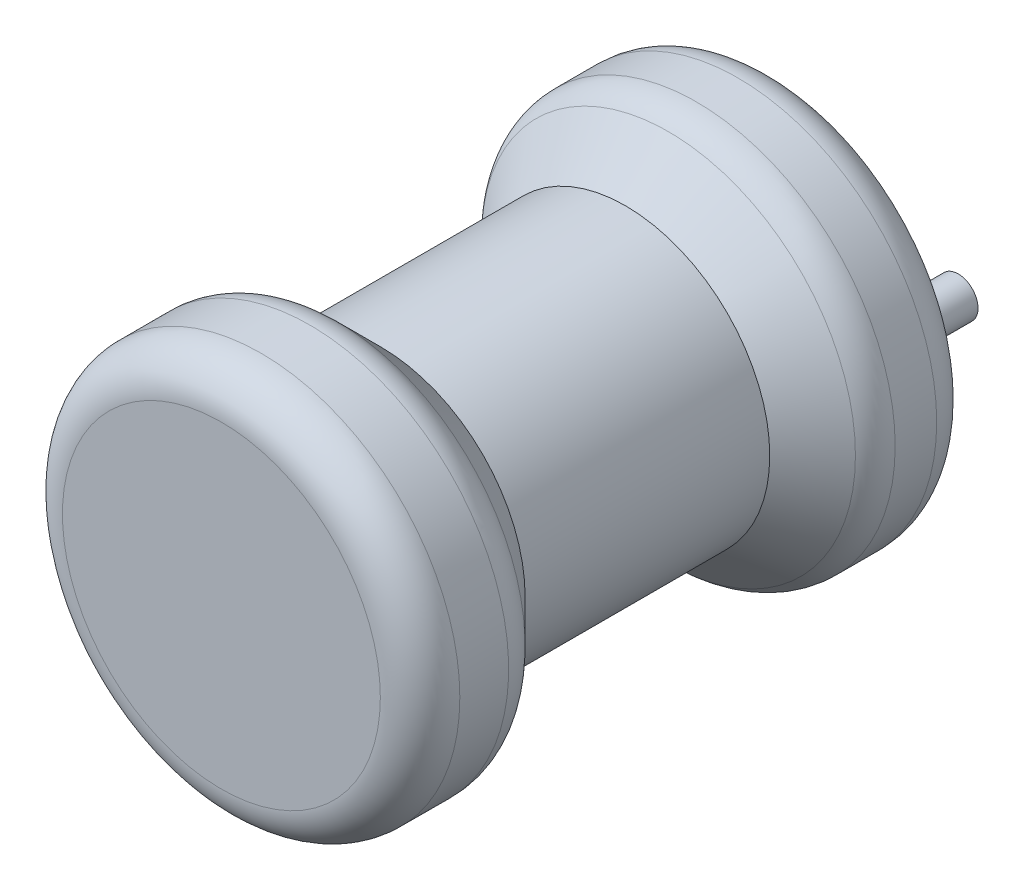
ISO-10303-21;
HEADER;
FILE_DESCRIPTION(('STEP AP214'),'2;1');
FILE_NAME('part.step','',(''),(''),'','','');
FILE_SCHEMA(('AUTOMOTIVE_DESIGN { 1 0 10303 214 1 1 1 1 }'));
ENDSEC;
DATA;
#1=APPLICATION_CONTEXT('core data for automotive mechanical design processes');
#2=APPLICATION_PROTOCOL_DEFINITION('international standard','automotive_design',2000,#1);
#3=PRODUCT_CONTEXT('',#1,'mechanical');
#4=PRODUCT('Part','Part','',(#3));
#5=PRODUCT_RELATED_PRODUCT_CATEGORY('part','',(#4));
#6=PRODUCT_DEFINITION_FORMATION('','',#4);
#7=PRODUCT_DEFINITION_CONTEXT('part definition',#1,'design');
#8=PRODUCT_DEFINITION('design','',#6,#7);
#9=PRODUCT_DEFINITION_SHAPE('','',#8);
#10=(LENGTH_UNIT() NAMED_UNIT(*) SI_UNIT(.MILLI.,.METRE.));
#11=(NAMED_UNIT(*) PLANE_ANGLE_UNIT() SI_UNIT($,.RADIAN.));
#12=(NAMED_UNIT(*) SI_UNIT($,.STERADIAN.) SOLID_ANGLE_UNIT());
#13=UNCERTAINTY_MEASURE_WITH_UNIT(LENGTH_MEASURE(1.E-05),#10,'distance_accuracy_value','');
#14=(GEOMETRIC_REPRESENTATION_CONTEXT(3) GLOBAL_UNCERTAINTY_ASSIGNED_CONTEXT((#13)) GLOBAL_UNIT_ASSIGNED_CONTEXT((#10,
#11,#12)) REPRESENTATION_CONTEXT('',''));
#15=CARTESIAN_POINT('',(0.,0.,0.));
#16=DIRECTION('',(0.,0.,1.));
#17=DIRECTION('',(1.,0.,0.));
#18=AXIS2_PLACEMENT_3D('',#15,#16,#17);
#19=CARTESIAN_POINT('',(0.,0.,14.));
#20=DIRECTION('',(0.,0.,-1.));
#21=DIRECTION('',(-1.,0.,0.));
#22=AXIS2_PLACEMENT_3D('',#19,#20,#21);
#23=CYLINDRICAL_SURFACE('',#22,5.);
#24=CARTESIAN_POINT('',(0.,0.,0.999999999999999));
#25=DIRECTION('',(0.,0.,1.));
#26=DIRECTION('',(1.,0.,0.));
#27=AXIS2_PLACEMENT_3D('',#24,#25,#26);
#28=CIRCLE('',#27,5.);
#29=CARTESIAN_POINT('',(5.,0.,0.999999999999999));
#30=VERTEX_POINT('',#29);
#31=EDGE_CURVE('E59',#30,#30,#28,.T.);
#32=ORIENTED_EDGE('',*,*,#31,.T.);
#33=EDGE_LOOP('',(#32));
#34=FACE_BOUND('',#33,.T.);
#35=CARTESIAN_POINT('',(0.,0.,2.04516003220069));
#36=DIRECTION('',(0.,0.,1.));
#37=DIRECTION('',(1.,0.,0.));
#38=AXIS2_PLACEMENT_3D('',#35,#36,#37);
#39=CIRCLE('',#38,5.);
#40=CARTESIAN_POINT('',(5.,0.,2.04516003220069));
#41=VERTEX_POINT('',#40);
#42=EDGE_CURVE('E62',#41,#41,#39,.F.);
#43=ORIENTED_EDGE('',*,*,#42,.T.);
#44=EDGE_LOOP('',(#43));
#45=FACE_BOUND('',#44,.T.);
#46=ADVANCED_FACE('F33',(#34,#45),#23,.T.);
#47=CARTESIAN_POINT('',(0.,0.,0.));
#48=DIRECTION('',(0.,0.,1.));
#49=DIRECTION('',(1.,0.,0.));
#50=AXIS2_PLACEMENT_3D('',#47,#48,#49);
#51=PLANE('',#50);
#52=CARTESIAN_POINT('',(0.,0.,0.));
#53=DIRECTION('',(0.,0.,1.));
#54=DIRECTION('',(1.,0.,0.));
#55=AXIS2_PLACEMENT_3D('',#52,#53,#54);
#56=CIRCLE('',#55,4.);
#57=CARTESIAN_POINT('',(4.,0.,0.));
#58=VERTEX_POINT('',#57);
#59=EDGE_CURVE('E56',#58,#58,#56,.F.);
#60=ORIENTED_EDGE('',*,*,#59,.T.);
#61=EDGE_LOOP('',(#60));
#62=FACE_BOUND('',#61,.T.);
#63=CARTESIAN_POINT('',(2.54,0.,0.));
#64=DIRECTION('',(0.,0.,1.));
#65=DIRECTION('',(-1.,0.,0.));
#66=AXIS2_PLACEMENT_3D('',#63,#64,#65);
#67=CIRCLE('',#66,0.500000000000001);
#68=CARTESIAN_POINT('',(2.04,0.,0.));
#69=VERTEX_POINT('',#68);
#70=EDGE_CURVE('E78',#69,#69,#67,.T.);
#71=ORIENTED_EDGE('',*,*,#70,.T.);
#72=EDGE_LOOP('',(#71));
#73=FACE_BOUND('',#72,.T.);
#74=CARTESIAN_POINT('',(-2.54,0.,0.));
#75=DIRECTION('',(0.,0.,1.));
#76=DIRECTION('',(1.,0.,0.));
#77=AXIS2_PLACEMENT_3D('',#74,#75,#76);
#78=CIRCLE('',#77,0.5);
#79=CARTESIAN_POINT('',(-2.04,0.,0.));
#80=VERTEX_POINT('',#79);
#81=EDGE_CURVE('E72',#80,#80,#78,.T.);
#82=ORIENTED_EDGE('',*,*,#81,.T.);
#83=EDGE_LOOP('',(#82));
#84=FACE_BOUND('',#83,.T.);
#85=ADVANCED_FACE('F101',(#62,#73,#84),#51,.F.);
#86=CARTESIAN_POINT('',(0.,0.,3.83032219744081));
#87=DIRECTION('',(0.,0.,-1.));
#88=DIRECTION('',(-1.,0.,0.));
#89=AXIS2_PLACEMENT_3D('',#86,#87,#88);
#90=CONICAL_SURFACE('',#89,3.62905139713295,0.785398163397458);
#91=CARTESIAN_POINT('',(0.,0.,2.75226681338724));
#92=DIRECTION('',(0.,0.,1.));
#93=DIRECTION('',(1.,0.,0.));
#94=AXIS2_PLACEMENT_3D('',#91,#92,#93);
#95=CIRCLE('',#94,4.70710678118654);
#96=CARTESIAN_POINT('',(4.70710678118654,0.,2.75226681338724));
#97=VERTEX_POINT('',#96);
#98=EDGE_CURVE('E53',#97,#97,#95,.T.);
#99=ORIENTED_EDGE('',*,*,#98,.T.);
#100=EDGE_LOOP('',(#99));
#101=FACE_BOUND('',#100,.T.);
#102=CARTESIAN_POINT('',(0.,0.,3.83032219744081));
#103=DIRECTION('',(0.,0.,-1.));
#104=DIRECTION('',(-1.,0.,0.));
#105=AXIS2_PLACEMENT_3D('',#102,#103,#104);
#106=CIRCLE('',#105,3.62905139713295);
#107=CARTESIAN_POINT('',(-3.62905139713295,0.,3.83032219744081));
#108=VERTEX_POINT('',#107);
#109=EDGE_CURVE('E65',#108,#108,#106,.T.);
#110=ORIENTED_EDGE('',*,*,#109,.T.);
#111=EDGE_LOOP('',(#110));
#112=FACE_BOUND('',#111,.T.);
#113=ADVANCED_FACE('F108',(#101,#112),#90,.T.);
#114=CARTESIAN_POINT('',(0.,0.,11.6299875146831));
#115=DIRECTION('',(0.,0.,1.));
#116=DIRECTION('',(1.,0.,0.));
#117=AXIS2_PLACEMENT_3D('',#114,#115,#116);
#118=CONICAL_SURFACE('',#117,5.27311054708641,0.785398163397449);
#119=CARTESIAN_POINT('',(0.,0.,11.0639837487833));
#120=DIRECTION('',(0.,0.,-1.));
#121=DIRECTION('',(-1.,0.,0.));
#122=AXIS2_PLACEMENT_3D('',#119,#120,#121);
#123=CIRCLE('',#122,4.70710678118655);
#124=CARTESIAN_POINT('',(-4.70710678118655,0.,11.0639837487833));
#125=VERTEX_POINT('',#124);
#126=EDGE_CURVE('E40',#125,#125,#123,.T.);
#127=ORIENTED_EDGE('',*,*,#126,.T.);
#128=EDGE_LOOP('',(#127));
#129=FACE_BOUND('',#128,.T.);
#130=CARTESIAN_POINT('',(0.,0.,9.98592836472965));
#131=DIRECTION('',(0.,0.,-1.));
#132=DIRECTION('',(-1.,0.,0.));
#133=AXIS2_PLACEMENT_3D('',#130,#131,#132);
#134=CIRCLE('',#133,3.62905139713295);
#135=CARTESIAN_POINT('',(-3.62905139713295,0.,9.98592836472965));
#136=VERTEX_POINT('',#135);
#137=EDGE_CURVE('E68',#136,#136,#134,.T.);
#138=ORIENTED_EDGE('',*,*,#137,.F.);
#139=EDGE_LOOP('',(#138));
#140=FACE_BOUND('',#139,.T.);
#141=ADVANCED_FACE('F149',(#129,#140),#118,.T.);
#142=CARTESIAN_POINT('',(0.,0.,-0.7));
#143=DIRECTION('',(0.,0.,-1.));
#144=DIRECTION('',(-1.,0.,0.));
#145=AXIS2_PLACEMENT_3D('',#142,#143,#144);
#146=CYLINDRICAL_SURFACE('',#145,3.62905139713295);
#147=ORIENTED_EDGE('',*,*,#109,.F.);
#148=EDGE_LOOP('',(#147));
#149=FACE_BOUND('',#148,.T.);
#150=ORIENTED_EDGE('',*,*,#137,.T.);
#151=EDGE_LOOP('',(#150));
#152=FACE_BOUND('',#151,.T.);
#153=ADVANCED_FACE('F122',(#149,#152),#146,.T.);
#154=CARTESIAN_POINT('',(0.,0.,14.));
#155=DIRECTION('',(0.,0.,1.));
#156=DIRECTION('',(1.,0.,0.));
#157=AXIS2_PLACEMENT_3D('',#154,#155,#156);
#158=PLANE('',#157);
#159=CARTESIAN_POINT('',(0.,0.,14.));
#160=DIRECTION('',(0.,0.,1.));
#161=DIRECTION('',(1.,0.,0.));
#162=AXIS2_PLACEMENT_3D('',#159,#160,#161);
#163=CIRCLE('',#162,4.);
#164=CARTESIAN_POINT('',(4.,0.,14.));
#165=VERTEX_POINT('',#164);
#166=EDGE_CURVE('E10',#165,#165,#163,.T.);
#167=ORIENTED_EDGE('',*,*,#166,.T.);
#168=EDGE_LOOP('',(#167));
#169=FACE_BOUND('',#168,.T.);
#170=ADVANCED_FACE('F114',(#169),#158,.T.);
#171=CARTESIAN_POINT('',(0.,0.,11.7710905299698));
#172=DIRECTION('',(0.,0.,-1.));
#173=DIRECTION('',(-1.,0.,0.));
#174=AXIS2_PLACEMENT_3D('',#171,#172,#173);
#175=CIRCLE('',#174,5.);
#176=CARTESIAN_POINT('',(-5.,0.,11.7710905299698));
#177=VERTEX_POINT('',#176);
#178=EDGE_CURVE('E44',#177,#177,#175,.F.);
#179=ORIENTED_EDGE('',*,*,#178,.T.);
#180=EDGE_LOOP('',(#179));
#181=FACE_BOUND('',#180,.T.);
#182=CARTESIAN_POINT('',(0.,0.,13.));
#183=DIRECTION('',(0.,0.,1.));
#184=DIRECTION('',(1.,0.,0.));
#185=AXIS2_PLACEMENT_3D('',#182,#183,#184);
#186=CIRCLE('',#185,5.);
#187=CARTESIAN_POINT('',(5.,0.,13.));
#188=VERTEX_POINT('',#187);
#189=EDGE_CURVE('E48',#188,#188,#186,.F.);
#190=ORIENTED_EDGE('',*,*,#189,.T.);
#191=EDGE_LOOP('',(#190));
#192=FACE_BOUND('',#191,.T.);
#193=ADVANCED_FACE('F104',(#181,#192),#23,.T.);
#194=CARTESIAN_POINT('',(-2.54,0.,-2.));
#195=DIRECTION('',(0.,0.,1.));
#196=DIRECTION('',(1.,0.,0.));
#197=AXIS2_PLACEMENT_3D('',#194,#195,#196);
#198=CYLINDRICAL_SURFACE('',#197,0.5);
#199=CARTESIAN_POINT('',(-2.54,0.,-2.));
#200=DIRECTION('',(0.,0.,1.));
#201=DIRECTION('',(1.,0.,0.));
#202=AXIS2_PLACEMENT_3D('',#199,#200,#201);
#203=CIRCLE('',#202,0.5);
#204=CARTESIAN_POINT('',(-2.04,0.,-2.));
#205=VERTEX_POINT('',#204);
#206=EDGE_CURVE('E71',#205,#205,#203,.T.);
#207=ORIENTED_EDGE('',*,*,#206,.T.);
#208=EDGE_LOOP('',(#207));
#209=FACE_BOUND('',#208,.T.);
#210=ORIENTED_EDGE('',*,*,#81,.F.);
#211=EDGE_LOOP('',(#210));
#212=FACE_BOUND('',#211,.T.);
#213=ADVANCED_FACE('F113',(#209,#212),#198,.T.);
#214=CARTESIAN_POINT('',(-2.54,0.,-2.));
#215=DIRECTION('',(0.,0.,1.));
#216=DIRECTION('',(1.,0.,0.));
#217=AXIS2_PLACEMENT_3D('',#214,#215,#216);
#218=PLANE('',#217);
#219=ORIENTED_EDGE('',*,*,#206,.F.);
#220=EDGE_LOOP('',(#219));
#221=FACE_BOUND('',#220,.T.);
#222=ADVANCED_FACE('F98',(#221),#218,.F.);
#223=CARTESIAN_POINT('',(2.54,0.,-2.));
#224=DIRECTION('',(0.,0.,1.));
#225=DIRECTION('',(1.,0.,0.));
#226=AXIS2_PLACEMENT_3D('',#223,#224,#225);
#227=CYLINDRICAL_SURFACE('',#226,0.500000000000001);
#228=CARTESIAN_POINT('',(2.54,0.,-2.));
#229=DIRECTION('',(0.,0.,1.));
#230=DIRECTION('',(-1.,0.,0.));
#231=AXIS2_PLACEMENT_3D('',#228,#229,#230);
#232=CIRCLE('',#231,0.500000000000001);
#233=CARTESIAN_POINT('',(2.04,0.,-2.));
#234=VERTEX_POINT('',#233);
#235=EDGE_CURVE('E75',#234,#234,#232,.T.);
#236=ORIENTED_EDGE('',*,*,#235,.T.);
#237=EDGE_LOOP('',(#236));
#238=FACE_BOUND('',#237,.T.);
#239=ORIENTED_EDGE('',*,*,#70,.F.);
#240=EDGE_LOOP('',(#239));
#241=FACE_BOUND('',#240,.T.);
#242=ADVANCED_FACE('F84',(#238,#241),#227,.T.);
#243=CARTESIAN_POINT('',(2.54,0.,-2.));
#244=DIRECTION('',(0.,0.,-1.));
#245=DIRECTION('',(-1.,0.,0.));
#246=AXIS2_PLACEMENT_3D('',#243,#244,#245);
#247=PLANE('',#246);
#248=ORIENTED_EDGE('',*,*,#235,.F.);
#249=EDGE_LOOP('',(#248));
#250=FACE_BOUND('',#249,.T.);
#251=ADVANCED_FACE('F87',(#250),#247,.T.);
#252=CARTESIAN_POINT('',(0.,0.,0.999999999999999));
#253=DIRECTION('',(0.,0.,1.));
#254=DIRECTION('',(1.,0.,0.));
#255=AXIS2_PLACEMENT_3D('',#252,#253,#254);
#256=TOROIDAL_SURFACE('',#255,4.,1.);
#257=ORIENTED_EDGE('',*,*,#59,.F.);
#258=EDGE_LOOP('',(#257));
#259=FACE_BOUND('',#258,.T.);
#260=ORIENTED_EDGE('',*,*,#31,.F.);
#261=EDGE_LOOP('',(#260));
#262=FACE_BOUND('',#261,.T.);
#263=ADVANCED_FACE('F89',(#259,#262),#256,.T.);
#264=CARTESIAN_POINT('',(0.,0.,2.04516003220069));
#265=DIRECTION('',(0.,0.,1.));
#266=DIRECTION('',(1.,0.,0.));
#267=AXIS2_PLACEMENT_3D('',#264,#265,#266);
#268=TOROIDAL_SURFACE('',#267,4.,1.);
#269=ORIENTED_EDGE('',*,*,#98,.F.);
#270=EDGE_LOOP('',(#269));
#271=FACE_BOUND('',#270,.T.);
#272=ORIENTED_EDGE('',*,*,#42,.F.);
#273=EDGE_LOOP('',(#272));
#274=FACE_BOUND('',#273,.T.);
#275=ADVANCED_FACE('F95',(#271,#274),#268,.T.);
#276=CARTESIAN_POINT('',(0.,0.,11.7710905299698));
#277=DIRECTION('',(0.,0.,-1.));
#278=DIRECTION('',(-1.,0.,0.));
#279=AXIS2_PLACEMENT_3D('',#276,#277,#278);
#280=TOROIDAL_SURFACE('',#279,4.,1.);
#281=ORIENTED_EDGE('',*,*,#126,.F.);
#282=EDGE_LOOP('',(#281));
#283=FACE_BOUND('',#282,.T.);
#284=ORIENTED_EDGE('',*,*,#178,.F.);
#285=EDGE_LOOP('',(#284));
#286=FACE_BOUND('',#285,.T.);
#287=ADVANCED_FACE('F130',(#283,#286),#280,.T.);
#288=CARTESIAN_POINT('',(0.,0.,13.));
#289=DIRECTION('',(0.,0.,1.));
#290=DIRECTION('',(1.,0.,0.));
#291=AXIS2_PLACEMENT_3D('',#288,#289,#290);
#292=TOROIDAL_SURFACE('',#291,4.,1.);
#293=ORIENTED_EDGE('',*,*,#189,.F.);
#294=EDGE_LOOP('',(#293));
#295=FACE_BOUND('',#294,.T.);
#296=ORIENTED_EDGE('',*,*,#166,.F.);
#297=EDGE_LOOP('',(#296));
#298=FACE_BOUND('',#297,.T.);
#299=ADVANCED_FACE('F35',(#295,#298),#292,.T.);
#300=CLOSED_SHELL('',(#46,#85,#113,#141,#153,#170,#193,#213,#222,#242,#251,#263,#275,#287,#299));
#301=MANIFOLD_SOLID_BREP('B2',#300);
#302=ADVANCED_BREP_SHAPE_REPRESENTATION('',(#18,#301),#14);
#303=SHAPE_DEFINITION_REPRESENTATION(#9,#302);
ENDSEC;
END-ISO-10303-21;
